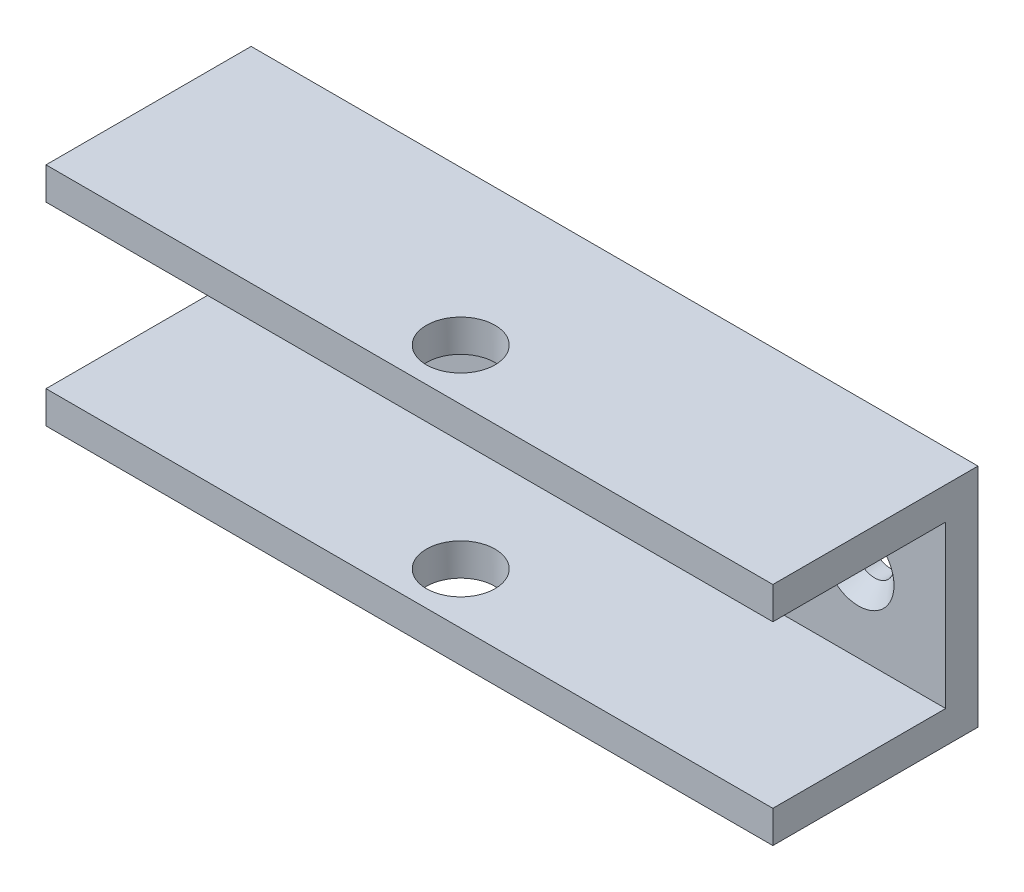
ISO-10303-21;
HEADER;
FILE_DESCRIPTION(('STEP AP214'),'2;1');
FILE_NAME('part.step','',(''),(''),'','','');
FILE_SCHEMA(('AUTOMOTIVE_DESIGN { 1 0 10303 214 1 1 1 1 }'));
ENDSEC;
DATA;
#1=APPLICATION_CONTEXT('core data for automotive mechanical design processes');
#2=APPLICATION_PROTOCOL_DEFINITION('international standard','automotive_design',2000,#1);
#3=PRODUCT_CONTEXT('',#1,'mechanical');
#4=PRODUCT('Part','Part','',(#3));
#5=PRODUCT_RELATED_PRODUCT_CATEGORY('part','',(#4));
#6=PRODUCT_DEFINITION_FORMATION('','',#4);
#7=PRODUCT_DEFINITION_CONTEXT('part definition',#1,'design');
#8=PRODUCT_DEFINITION('design','',#6,#7);
#9=PRODUCT_DEFINITION_SHAPE('','',#8);
#10=(LENGTH_UNIT() NAMED_UNIT(*) SI_UNIT(.MILLI.,.METRE.));
#11=(NAMED_UNIT(*) PLANE_ANGLE_UNIT() SI_UNIT($,.RADIAN.));
#12=(NAMED_UNIT(*) SI_UNIT($,.STERADIAN.) SOLID_ANGLE_UNIT());
#13=UNCERTAINTY_MEASURE_WITH_UNIT(LENGTH_MEASURE(1.E-05),#10,'distance_accuracy_value','');
#14=(GEOMETRIC_REPRESENTATION_CONTEXT(3) GLOBAL_UNCERTAINTY_ASSIGNED_CONTEXT((#13)) GLOBAL_UNIT_ASSIGNED_CONTEXT((#10,
#11,#12)) REPRESENTATION_CONTEXT('',''));
#15=CARTESIAN_POINT('',(0.,0.,0.));
#16=DIRECTION('',(0.,0.,1.));
#17=DIRECTION('',(1.,0.,0.));
#18=AXIS2_PLACEMENT_3D('',#15,#16,#17);
#19=CARTESIAN_POINT('',(0.,0.,12.7));
#20=DIRECTION('',(0.,0.,-1.));
#21=DIRECTION('',(-1.,0.,0.));
#22=AXIS2_PLACEMENT_3D('',#19,#20,#21);
#23=PLANE('',#22);
#24=DIRECTION('',(0.,1.,0.));
#25=VECTOR('',#24,1.);
#26=CARTESIAN_POINT('',(22.5,-7.,12.7));
#27=LINE('',#26,#25);
#28=CARTESIAN_POINT('',(22.5,-7.,12.7));
#29=VERTEX_POINT('',#28);
#30=CARTESIAN_POINT('',(22.5,-5.,12.7));
#31=VERTEX_POINT('',#30);
#32=EDGE_CURVE('E145',#29,#31,#27,.T.);
#33=ORIENTED_EDGE('',*,*,#32,.T.);
#34=DIRECTION('',(1.,0.,0.));
#35=VECTOR('',#34,1.);
#36=CARTESIAN_POINT('',(-22.5,-5.,12.7));
#37=LINE('',#36,#35);
#38=CARTESIAN_POINT('',(-22.5,-5.,12.7));
#39=VERTEX_POINT('',#38);
#40=EDGE_CURVE('E133',#39,#31,#37,.T.);
#41=ORIENTED_EDGE('',*,*,#40,.F.);
#42=DIRECTION('',(0.,-1.,0.));
#43=VECTOR('',#42,1.);
#44=CARTESIAN_POINT('',(-22.5,-7.,12.7));
#45=LINE('',#44,#43);
#46=CARTESIAN_POINT('',(-22.5,-7.,12.7));
#47=VERTEX_POINT('',#46);
#48=EDGE_CURVE('E151',#39,#47,#45,.T.);
#49=ORIENTED_EDGE('',*,*,#48,.T.);
#50=DIRECTION('',(1.,0.,0.));
#51=VECTOR('',#50,1.);
#52=CARTESIAN_POINT('',(-22.5,-7.,12.7));
#53=LINE('',#52,#51);
#54=EDGE_CURVE('E65',#47,#29,#53,.T.);
#55=ORIENTED_EDGE('',*,*,#54,.T.);
#56=EDGE_LOOP('',(#33,#41,#49,#55));
#57=FACE_BOUND('',#56,.T.);
#58=ADVANCED_FACE('F39',(#57),#23,.F.);
#59=CARTESIAN_POINT('',(22.5,-7.,12.7));
#60=DIRECTION('',(-1.,0.,0.));
#61=DIRECTION('',(0.,0.,1.));
#62=AXIS2_PLACEMENT_3D('',#59,#60,#61);
#63=PLANE('',#62);
#64=DIRECTION('',(0.,1.,0.));
#65=VECTOR('',#64,1.);
#66=CARTESIAN_POINT('',(22.5,-5.,2.));
#67=LINE('',#66,#65);
#68=CARTESIAN_POINT('',(22.5,-5.,2.));
#69=VERTEX_POINT('',#68);
#70=CARTESIAN_POINT('',(22.5,5.,2.));
#71=VERTEX_POINT('',#70);
#72=EDGE_CURVE('E123',#69,#71,#67,.T.);
#73=ORIENTED_EDGE('',*,*,#72,.F.);
#74=DIRECTION('',(0.,0.,1.));
#75=VECTOR('',#74,1.);
#76=CARTESIAN_POINT('',(22.5,-5.,2.));
#77=LINE('',#76,#75);
#78=EDGE_CURVE('E164',#69,#31,#77,.T.);
#79=ORIENTED_EDGE('',*,*,#78,.T.);
#80=ORIENTED_EDGE('',*,*,#32,.F.);
#81=DIRECTION('',(0.,0.,-1.));
#82=VECTOR('',#81,1.);
#83=CARTESIAN_POINT('',(22.5,-7.,12.7));
#84=LINE('',#83,#82);
#85=CARTESIAN_POINT('',(22.5,-7.,0.));
#86=VERTEX_POINT('',#85);
#87=EDGE_CURVE('E158',#29,#86,#84,.T.);
#88=ORIENTED_EDGE('',*,*,#87,.T.);
#89=DIRECTION('',(0.,1.,0.));
#90=VECTOR('',#89,1.);
#91=CARTESIAN_POINT('',(22.5,-7.,0.));
#92=LINE('',#91,#90);
#93=CARTESIAN_POINT('',(22.5,7.,0.));
#94=VERTEX_POINT('',#93);
#95=EDGE_CURVE('E159',#86,#94,#92,.T.);
#96=ORIENTED_EDGE('',*,*,#95,.T.);
#97=DIRECTION('',(0.,0.,-1.));
#98=VECTOR('',#97,1.);
#99=CARTESIAN_POINT('',(22.5,7.,12.7));
#100=LINE('',#99,#98);
#101=CARTESIAN_POINT('',(22.5,7.,12.7));
#102=VERTEX_POINT('',#101);
#103=EDGE_CURVE('E11',#102,#94,#100,.T.);
#104=ORIENTED_EDGE('',*,*,#103,.F.);
#105=CARTESIAN_POINT('',(22.5,5.,12.7));
#106=VERTEX_POINT('',#105);
#107=EDGE_CURVE('E93',#106,#102,#27,.T.);
#108=ORIENTED_EDGE('',*,*,#107,.F.);
#109=DIRECTION('',(0.,0.,1.));
#110=VECTOR('',#109,1.);
#111=CARTESIAN_POINT('',(22.5,5.,2.));
#112=LINE('',#111,#110);
#113=EDGE_CURVE('E56',#71,#106,#112,.T.);
#114=ORIENTED_EDGE('',*,*,#113,.F.);
#115=EDGE_LOOP('',(#73,#79,#80,#88,#96,#104,#108,#114));
#116=FACE_BOUND('',#115,.T.);
#117=ADVANCED_FACE('F41',(#116),#63,.F.);
#118=CARTESIAN_POINT('',(-22.5,7.,12.7));
#119=DIRECTION('',(0.,-1.,0.));
#120=DIRECTION('',(0.,0.,-1.));
#121=AXIS2_PLACEMENT_3D('',#118,#119,#120);
#122=PLANE('',#121);
#123=CARTESIAN_POINT('',(0.,7.,9.525));
#124=DIRECTION('',(0.,-1.,0.));
#125=DIRECTION('',(0.,0.,-1.));
#126=AXIS2_PLACEMENT_3D('',#123,#124,#125);
#127=CIRCLE('',#126,2.125);
#128=CARTESIAN_POINT('',(0.,7.,7.4));
#129=VERTEX_POINT('',#128);
#130=EDGE_CURVE('E232',#129,#129,#127,.T.);
#131=ORIENTED_EDGE('',*,*,#130,.T.);
#132=EDGE_LOOP('',(#131));
#133=FACE_BOUND('',#132,.T.);
#134=DIRECTION('',(-1.,0.,0.));
#135=VECTOR('',#134,1.);
#136=CARTESIAN_POINT('',(-22.5,7.,0.));
#137=LINE('',#136,#135);
#138=CARTESIAN_POINT('',(-22.5,7.,0.));
#139=VERTEX_POINT('',#138);
#140=EDGE_CURVE('E163',#94,#139,#137,.T.);
#141=ORIENTED_EDGE('',*,*,#140,.T.);
#142=DIRECTION('',(0.,0.,-1.));
#143=VECTOR('',#142,1.);
#144=CARTESIAN_POINT('',(-22.5,7.,12.7));
#145=LINE('',#144,#143);
#146=CARTESIAN_POINT('',(-22.5,7.,12.7));
#147=VERTEX_POINT('',#146);
#148=EDGE_CURVE('E49',#147,#139,#145,.T.);
#149=ORIENTED_EDGE('',*,*,#148,.F.);
#150=DIRECTION('',(-1.,0.,0.));
#151=VECTOR('',#150,1.);
#152=CARTESIAN_POINT('',(-22.5,7.,12.7));
#153=LINE('',#152,#151);
#154=EDGE_CURVE('E148',#102,#147,#153,.T.);
#155=ORIENTED_EDGE('',*,*,#154,.F.);
#156=ORIENTED_EDGE('',*,*,#103,.T.);
#157=EDGE_LOOP('',(#141,#149,#155,#156));
#158=FACE_BOUND('',#157,.T.);
#159=ADVANCED_FACE('F258',(#133,#158),#122,.F.);
#160=CARTESIAN_POINT('',(-22.5,-7.,12.7));
#161=DIRECTION('',(1.,0.,0.));
#162=DIRECTION('',(0.,0.,-1.));
#163=AXIS2_PLACEMENT_3D('',#160,#161,#162);
#164=PLANE('',#163);
#165=ORIENTED_EDGE('',*,*,#48,.F.);
#166=DIRECTION('',(0.,0.,1.));
#167=VECTOR('',#166,1.);
#168=CARTESIAN_POINT('',(-22.5,-5.,2.));
#169=LINE('',#168,#167);
#170=CARTESIAN_POINT('',(-22.5,-5.,2.));
#171=VERTEX_POINT('',#170);
#172=EDGE_CURVE('E140',#171,#39,#169,.T.);
#173=ORIENTED_EDGE('',*,*,#172,.F.);
#174=DIRECTION('',(0.,-1.,0.));
#175=VECTOR('',#174,1.);
#176=CARTESIAN_POINT('',(-22.5,-5.,2.));
#177=LINE('',#176,#175);
#178=CARTESIAN_POINT('',(-22.5,5.,2.));
#179=VERTEX_POINT('',#178);
#180=EDGE_CURVE('E122',#179,#171,#177,.T.);
#181=ORIENTED_EDGE('',*,*,#180,.F.);
#182=DIRECTION('',(0.,0.,1.));
#183=VECTOR('',#182,1.);
#184=CARTESIAN_POINT('',(-22.5,5.,2.));
#185=LINE('',#184,#183);
#186=CARTESIAN_POINT('',(-22.5,5.,12.7));
#187=VERTEX_POINT('',#186);
#188=EDGE_CURVE('E118',#179,#187,#185,.T.);
#189=ORIENTED_EDGE('',*,*,#188,.T.);
#190=EDGE_CURVE('E152',#147,#187,#45,.T.);
#191=ORIENTED_EDGE('',*,*,#190,.F.);
#192=ORIENTED_EDGE('',*,*,#148,.T.);
#193=DIRECTION('',(0.,-1.,0.));
#194=VECTOR('',#193,1.);
#195=CARTESIAN_POINT('',(-22.5,-7.,0.));
#196=LINE('',#195,#194);
#197=CARTESIAN_POINT('',(-22.5,-7.,0.));
#198=VERTEX_POINT('',#197);
#199=EDGE_CURVE('E167',#139,#198,#196,.T.);
#200=ORIENTED_EDGE('',*,*,#199,.T.);
#201=DIRECTION('',(0.,0.,-1.));
#202=VECTOR('',#201,1.);
#203=CARTESIAN_POINT('',(-22.5,-7.,12.7));
#204=LINE('',#203,#202);
#205=EDGE_CURVE('E174',#47,#198,#204,.T.);
#206=ORIENTED_EDGE('',*,*,#205,.F.);
#207=EDGE_LOOP('',(#165,#173,#181,#189,#191,#192,#200,#206));
#208=FACE_BOUND('',#207,.T.);
#209=ADVANCED_FACE('F184',(#208),#164,.F.);
#210=CARTESIAN_POINT('',(-22.5,-7.,12.7));
#211=DIRECTION('',(0.,1.,0.));
#212=DIRECTION('',(0.,0.,1.));
#213=AXIS2_PLACEMENT_3D('',#210,#211,#212);
#214=PLANE('',#213);
#215=CARTESIAN_POINT('',(0.,-7.,9.525));
#216=DIRECTION('',(0.,1.,0.));
#217=DIRECTION('',(0.,0.,1.));
#218=AXIS2_PLACEMENT_3D('',#215,#216,#217);
#219=CIRCLE('',#218,2.125);
#220=CARTESIAN_POINT('',(0.,-7.,11.65));
#221=VERTEX_POINT('',#220);
#222=EDGE_CURVE('E240',#221,#221,#219,.T.);
#223=ORIENTED_EDGE('',*,*,#222,.T.);
#224=EDGE_LOOP('',(#223));
#225=FACE_BOUND('',#224,.T.);
#226=DIRECTION('',(1.,0.,0.));
#227=VECTOR('',#226,1.);
#228=CARTESIAN_POINT('',(-22.5,-7.,0.));
#229=LINE('',#228,#227);
#230=EDGE_CURVE('E86',#198,#86,#229,.T.);
#231=ORIENTED_EDGE('',*,*,#230,.T.);
#232=ORIENTED_EDGE('',*,*,#87,.F.);
#233=ORIENTED_EDGE('',*,*,#54,.F.);
#234=ORIENTED_EDGE('',*,*,#205,.T.);
#235=EDGE_LOOP('',(#231,#232,#233,#234));
#236=FACE_BOUND('',#235,.T.);
#237=ADVANCED_FACE('F191',(#225,#236),#214,.F.);
#238=ORIENTED_EDGE('',*,*,#190,.T.);
#239=DIRECTION('',(-1.,0.,0.));
#240=VECTOR('',#239,1.);
#241=CARTESIAN_POINT('',(-22.5,5.,12.7));
#242=LINE('',#241,#240);
#243=EDGE_CURVE('E203',#106,#187,#242,.T.);
#244=ORIENTED_EDGE('',*,*,#243,.F.);
#245=ORIENTED_EDGE('',*,*,#107,.T.);
#246=ORIENTED_EDGE('',*,*,#154,.T.);
#247=EDGE_LOOP('',(#238,#244,#245,#246));
#248=FACE_BOUND('',#247,.T.);
#249=ADVANCED_FACE('F260',(#248),#23,.F.);
#250=CARTESIAN_POINT('',(0.,0.,0.));
#251=DIRECTION('',(0.,0.,-1.));
#252=DIRECTION('',(-1.,0.,0.));
#253=AXIS2_PLACEMENT_3D('',#250,#251,#252);
#254=PLANE('',#253);
#255=CARTESIAN_POINT('',(-17.1,0.,0.));
#256=DIRECTION('',(0.,0.,1.));
#257=DIRECTION('',(1.,0.,0.));
#258=AXIS2_PLACEMENT_3D('',#255,#256,#257);
#259=CIRCLE('',#258,1.2);
#260=CARTESIAN_POINT('',(-15.9,0.,0.));
#261=VERTEX_POINT('',#260);
#262=EDGE_CURVE('E220',#261,#261,#259,.T.);
#263=ORIENTED_EDGE('',*,*,#262,.T.);
#264=EDGE_LOOP('',(#263));
#265=FACE_BOUND('',#264,.T.);
#266=CARTESIAN_POINT('',(17.1,0.,0.));
#267=DIRECTION('',(0.,0.,1.));
#268=DIRECTION('',(1.,0.,0.));
#269=AXIS2_PLACEMENT_3D('',#266,#267,#268);
#270=CIRCLE('',#269,1.2);
#271=CARTESIAN_POINT('',(18.3,0.,0.));
#272=VERTEX_POINT('',#271);
#273=EDGE_CURVE('E205',#272,#272,#270,.T.);
#274=ORIENTED_EDGE('',*,*,#273,.T.);
#275=EDGE_LOOP('',(#274));
#276=FACE_BOUND('',#275,.T.);
#277=ORIENTED_EDGE('',*,*,#95,.F.);
#278=ORIENTED_EDGE('',*,*,#230,.F.);
#279=ORIENTED_EDGE('',*,*,#199,.F.);
#280=ORIENTED_EDGE('',*,*,#140,.F.);
#281=EDGE_LOOP('',(#277,#278,#279,#280));
#282=FACE_BOUND('',#281,.T.);
#283=ADVANCED_FACE('F189',(#265,#276,#282),#254,.T.);
#284=CARTESIAN_POINT('',(-22.5,-5.,2.));
#285=DIRECTION('',(0.,-1.,0.));
#286=DIRECTION('',(0.,0.,-1.));
#287=AXIS2_PLACEMENT_3D('',#284,#285,#286);
#288=PLANE('',#287);
#289=CARTESIAN_POINT('',(0.,-5.,9.525));
#290=DIRECTION('',(0.,-1.,0.));
#291=DIRECTION('',(0.,0.,-1.));
#292=AXIS2_PLACEMENT_3D('',#289,#290,#291);
#293=CIRCLE('',#292,2.125);
#294=CARTESIAN_POINT('',(0.,-5.,7.4));
#295=VERTEX_POINT('',#294);
#296=EDGE_CURVE('E236',#295,#295,#293,.T.);
#297=ORIENTED_EDGE('',*,*,#296,.T.);
#298=EDGE_LOOP('',(#297));
#299=FACE_BOUND('',#298,.T.);
#300=ORIENTED_EDGE('',*,*,#40,.T.);
#301=ORIENTED_EDGE('',*,*,#78,.F.);
#302=DIRECTION('',(1.,0.,0.));
#303=VECTOR('',#302,1.);
#304=CARTESIAN_POINT('',(-22.5,-5.,2.));
#305=LINE('',#304,#303);
#306=EDGE_CURVE('E129',#171,#69,#305,.T.);
#307=ORIENTED_EDGE('',*,*,#306,.F.);
#308=ORIENTED_EDGE('',*,*,#172,.T.);
#309=EDGE_LOOP('',(#300,#301,#307,#308));
#310=FACE_BOUND('',#309,.T.);
#311=ADVANCED_FACE('F261',(#299,#310),#288,.F.);
#312=CARTESIAN_POINT('',(-22.5,5.,2.));
#313=DIRECTION('',(0.,1.,0.));
#314=DIRECTION('',(0.,0.,1.));
#315=AXIS2_PLACEMENT_3D('',#312,#313,#314);
#316=PLANE('',#315);
#317=CARTESIAN_POINT('',(0.,5.,9.525));
#318=DIRECTION('',(0.,1.,0.));
#319=DIRECTION('',(0.,0.,1.));
#320=AXIS2_PLACEMENT_3D('',#317,#318,#319);
#321=CIRCLE('',#320,2.125);
#322=CARTESIAN_POINT('',(0.,5.,11.65));
#323=VERTEX_POINT('',#322);
#324=EDGE_CURVE('E43',#323,#323,#321,.T.);
#325=ORIENTED_EDGE('',*,*,#324,.T.);
#326=EDGE_LOOP('',(#325));
#327=FACE_BOUND('',#326,.T.);
#328=ORIENTED_EDGE('',*,*,#243,.T.);
#329=ORIENTED_EDGE('',*,*,#188,.F.);
#330=DIRECTION('',(-1.,0.,0.));
#331=VECTOR('',#330,1.);
#332=CARTESIAN_POINT('',(-22.5,5.,2.));
#333=LINE('',#332,#331);
#334=EDGE_CURVE('E114',#71,#179,#333,.T.);
#335=ORIENTED_EDGE('',*,*,#334,.F.);
#336=ORIENTED_EDGE('',*,*,#113,.T.);
#337=EDGE_LOOP('',(#328,#329,#335,#336));
#338=FACE_BOUND('',#337,.T.);
#339=ADVANCED_FACE('F116',(#327,#338),#316,.F.);
#340=CARTESIAN_POINT('',(0.,0.,2.));
#341=DIRECTION('',(0.,0.,-1.));
#342=DIRECTION('',(-1.,0.,0.));
#343=AXIS2_PLACEMENT_3D('',#340,#341,#342);
#344=PLANE('',#343);
#345=CARTESIAN_POINT('',(-17.1,0.,2.));
#346=DIRECTION('',(0.,0.,1.));
#347=DIRECTION('',(1.,0.,0.));
#348=AXIS2_PLACEMENT_3D('',#345,#346,#347);
#349=CIRCLE('',#348,2.2);
#350=CARTESIAN_POINT('',(-14.9,0.,2.));
#351=VERTEX_POINT('',#350);
#352=EDGE_CURVE('E228',#351,#351,#349,.T.);
#353=ORIENTED_EDGE('',*,*,#352,.F.);
#354=EDGE_LOOP('',(#353));
#355=FACE_BOUND('',#354,.T.);
#356=CARTESIAN_POINT('',(17.1,0.,2.));
#357=DIRECTION('',(0.,0.,1.));
#358=DIRECTION('',(1.,0.,0.));
#359=AXIS2_PLACEMENT_3D('',#356,#357,#358);
#360=CIRCLE('',#359,2.2);
#361=CARTESIAN_POINT('',(19.3,0.,2.));
#362=VERTEX_POINT('',#361);
#363=EDGE_CURVE('E216',#362,#362,#360,.T.);
#364=ORIENTED_EDGE('',*,*,#363,.F.);
#365=EDGE_LOOP('',(#364));
#366=FACE_BOUND('',#365,.T.);
#367=ORIENTED_EDGE('',*,*,#72,.T.);
#368=ORIENTED_EDGE('',*,*,#334,.T.);
#369=ORIENTED_EDGE('',*,*,#180,.T.);
#370=ORIENTED_EDGE('',*,*,#306,.T.);
#371=EDGE_LOOP('',(#367,#368,#369,#370));
#372=FACE_BOUND('',#371,.T.);
#373=ADVANCED_FACE('F127',(#355,#366,#372),#344,.F.);
#374=CARTESIAN_POINT('',(17.1,0.,2.));
#375=DIRECTION('',(0.,0.,1.));
#376=DIRECTION('',(1.,0.,0.));
#377=AXIS2_PLACEMENT_3D('',#374,#375,#376);
#378=CYLINDRICAL_SURFACE('',#377,1.2);
#379=ORIENTED_EDGE('',*,*,#273,.F.);
#380=EDGE_LOOP('',(#379));
#381=FACE_BOUND('',#380,.T.);
#382=CARTESIAN_POINT('',(17.1,0.,0.999999999999998));
#383=DIRECTION('',(0.,0.,1.));
#384=DIRECTION('',(1.,0.,0.));
#385=AXIS2_PLACEMENT_3D('',#382,#383,#384);
#386=CIRCLE('',#385,1.2);
#387=CARTESIAN_POINT('',(18.3,0.,0.999999999999998));
#388=VERTEX_POINT('',#387);
#389=EDGE_CURVE('E212',#388,#388,#386,.T.);
#390=ORIENTED_EDGE('',*,*,#389,.T.);
#391=EDGE_LOOP('',(#390));
#392=FACE_BOUND('',#391,.T.);
#393=ADVANCED_FACE('F325',(#381,#392),#378,.F.);
#394=CARTESIAN_POINT('',(17.1,0.,2.));
#395=DIRECTION('',(0.,0.,1.));
#396=DIRECTION('',(1.,0.,0.));
#397=AXIS2_PLACEMENT_3D('',#394,#395,#396);
#398=CONICAL_SURFACE('',#397,2.2,0.785398163397448);
#399=ORIENTED_EDGE('',*,*,#389,.F.);
#400=EDGE_LOOP('',(#399));
#401=FACE_BOUND('',#400,.T.);
#402=ORIENTED_EDGE('',*,*,#363,.T.);
#403=EDGE_LOOP('',(#402));
#404=FACE_BOUND('',#403,.T.);
#405=ADVANCED_FACE('F334',(#401,#404),#398,.F.);
#406=CARTESIAN_POINT('',(-17.1,0.,2.));
#407=DIRECTION('',(0.,0.,1.));
#408=DIRECTION('',(1.,0.,0.));
#409=AXIS2_PLACEMENT_3D('',#406,#407,#408);
#410=CYLINDRICAL_SURFACE('',#409,1.2);
#411=ORIENTED_EDGE('',*,*,#262,.F.);
#412=EDGE_LOOP('',(#411));
#413=FACE_BOUND('',#412,.T.);
#414=CARTESIAN_POINT('',(-17.1,0.,0.999999999999998));
#415=DIRECTION('',(0.,0.,1.));
#416=DIRECTION('',(1.,0.,0.));
#417=AXIS2_PLACEMENT_3D('',#414,#415,#416);
#418=CIRCLE('',#417,1.2);
#419=CARTESIAN_POINT('',(-15.9,0.,0.999999999999998));
#420=VERTEX_POINT('',#419);
#421=EDGE_CURVE('E224',#420,#420,#418,.T.);
#422=ORIENTED_EDGE('',*,*,#421,.T.);
#423=EDGE_LOOP('',(#422));
#424=FACE_BOUND('',#423,.T.);
#425=ADVANCED_FACE('F343',(#413,#424),#410,.F.);
#426=CARTESIAN_POINT('',(-17.1,0.,2.));
#427=DIRECTION('',(0.,0.,1.));
#428=DIRECTION('',(1.,0.,0.));
#429=AXIS2_PLACEMENT_3D('',#426,#427,#428);
#430=CONICAL_SURFACE('',#429,2.2,0.785398163397448);
#431=ORIENTED_EDGE('',*,*,#421,.F.);
#432=EDGE_LOOP('',(#431));
#433=FACE_BOUND('',#432,.T.);
#434=ORIENTED_EDGE('',*,*,#352,.T.);
#435=EDGE_LOOP('',(#434));
#436=FACE_BOUND('',#435,.T.);
#437=ADVANCED_FACE('F254',(#433,#436),#430,.F.);
#438=CARTESIAN_POINT('',(0.,-7.,9.525));
#439=DIRECTION('',(0.,1.,0.));
#440=DIRECTION('',(0.,0.,1.));
#441=AXIS2_PLACEMENT_3D('',#438,#439,#440);
#442=CYLINDRICAL_SURFACE('',#441,2.125);
#443=ORIENTED_EDGE('',*,*,#324,.F.);
#444=EDGE_LOOP('',(#443));
#445=FACE_BOUND('',#444,.T.);
#446=ORIENTED_EDGE('',*,*,#130,.F.);
#447=EDGE_LOOP('',(#446));
#448=FACE_BOUND('',#447,.T.);
#449=ADVANCED_FACE('F250',(#445,#448),#442,.F.);
#450=ORIENTED_EDGE('',*,*,#222,.F.);
#451=EDGE_LOOP('',(#450));
#452=FACE_BOUND('',#451,.T.);
#453=ORIENTED_EDGE('',*,*,#296,.F.);
#454=EDGE_LOOP('',(#453));
#455=FACE_BOUND('',#454,.T.);
#456=ADVANCED_FACE('F253',(#452,#455),#442,.F.);
#457=CLOSED_SHELL('',(#58,#117,#159,#209,#237,#249,#283,#311,#339,#373,#393,#405,#425,#437,#449,#456));
#458=MANIFOLD_SOLID_BREP('B2',#457);
#459=ADVANCED_BREP_SHAPE_REPRESENTATION('',(#18,#458),#14);
#460=SHAPE_DEFINITION_REPRESENTATION(#9,#459);
ENDSEC;
END-ISO-10303-21;
